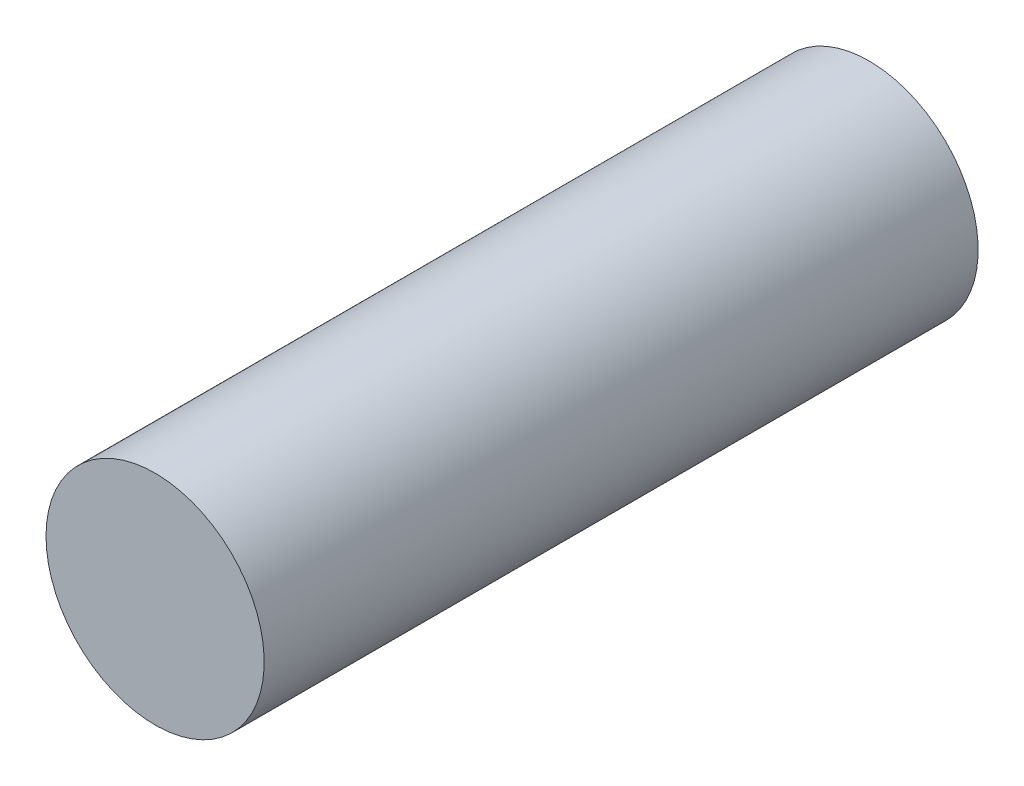
ISO-10303-21;
HEADER;
FILE_DESCRIPTION(('STEP AP214'),'2;1');
FILE_NAME('part.step','',(''),(''),'','','');
FILE_SCHEMA(('AUTOMOTIVE_DESIGN { 1 0 10303 214 1 1 1 1 }'));
ENDSEC;
DATA;
#1=APPLICATION_CONTEXT('core data for automotive mechanical design processes');
#2=APPLICATION_PROTOCOL_DEFINITION('international standard','automotive_design',2000,#1);
#3=PRODUCT_CONTEXT('',#1,'mechanical');
#4=PRODUCT('Part','Part','',(#3));
#5=PRODUCT_RELATED_PRODUCT_CATEGORY('part','',(#4));
#6=PRODUCT_DEFINITION_FORMATION('','',#4);
#7=PRODUCT_DEFINITION_CONTEXT('part definition',#1,'design');
#8=PRODUCT_DEFINITION('design','',#6,#7);
#9=PRODUCT_DEFINITION_SHAPE('','',#8);
#10=(LENGTH_UNIT() NAMED_UNIT(*) SI_UNIT(.MILLI.,.METRE.));
#11=(NAMED_UNIT(*) PLANE_ANGLE_UNIT() SI_UNIT($,.RADIAN.));
#12=(NAMED_UNIT(*) SI_UNIT($,.STERADIAN.) SOLID_ANGLE_UNIT());
#13=UNCERTAINTY_MEASURE_WITH_UNIT(LENGTH_MEASURE(1.E-05),#10,'distance_accuracy_value','');
#14=(GEOMETRIC_REPRESENTATION_CONTEXT(3) GLOBAL_UNCERTAINTY_ASSIGNED_CONTEXT((#13)) GLOBAL_UNIT_ASSIGNED_CONTEXT((#10,
#11,#12)) REPRESENTATION_CONTEXT('',''));
#15=CARTESIAN_POINT('',(0.,0.,0.));
#16=DIRECTION('',(0.,0.,1.));
#17=DIRECTION('',(1.,0.,0.));
#18=AXIS2_PLACEMENT_3D('',#15,#16,#17);
#19=CARTESIAN_POINT('',(0.,0.,180.));
#20=DIRECTION('',(0.,0.,-1.));
#21=DIRECTION('',(-1.,0.,0.));
#22=AXIS2_PLACEMENT_3D('',#19,#20,#21);
#23=CYLINDRICAL_SURFACE('',#22,27.5);
#24=CARTESIAN_POINT('',(0.,0.,180.));
#25=DIRECTION('',(0.,0.,1.));
#26=DIRECTION('',(1.,0.,0.));
#27=AXIS2_PLACEMENT_3D('',#24,#25,#26);
#28=CIRCLE('',#27,27.5);
#29=CARTESIAN_POINT('',(-27.5,0.,180.));
#30=VERTEX_POINT('',#29);
#31=EDGE_CURVE('E10',#30,#30,#28,.T.);
#32=CARTESIAN_POINT('',(0.,0.,0.));
#33=DIRECTION('',(0.,0.,1.));
#34=DIRECTION('',(1.,0.,0.));
#35=AXIS2_PLACEMENT_3D('',#32,#33,#34);
#36=CIRCLE('',#35,27.5);
#37=CARTESIAN_POINT('',(-27.5,0.,0.));
#38=VERTEX_POINT('',#37);
#39=EDGE_CURVE('E37',#38,#38,#36,.T.);
#40=CARTESIAN_POINT('',(-27.5,0.,180.));
#41=CARTESIAN_POINT('',(-27.5,0.,178.125));
#42=CARTESIAN_POINT('',(-27.5,0.,176.25));
#43=CARTESIAN_POINT('',(-27.5,0.,172.5));
#44=CARTESIAN_POINT('',(-27.5,0.,170.625));
#45=CARTESIAN_POINT('',(-27.5,0.,166.875));
#46=CARTESIAN_POINT('',(-27.5,0.,165.));
#47=CARTESIAN_POINT('',(-27.5,0.,161.25));
#48=CARTESIAN_POINT('',(-27.5,0.,159.375));
#49=CARTESIAN_POINT('',(-27.5,0.,155.625));
#50=CARTESIAN_POINT('',(-27.5,0.,153.75));
#51=CARTESIAN_POINT('',(-27.5,0.,150.));
#52=CARTESIAN_POINT('',(-27.5,0.,148.125));
#53=CARTESIAN_POINT('',(-27.5,0.,144.375));
#54=CARTESIAN_POINT('',(-27.5,0.,142.5));
#55=CARTESIAN_POINT('',(-27.5,0.,138.75));
#56=CARTESIAN_POINT('',(-27.5,0.,136.875));
#57=CARTESIAN_POINT('',(-27.5,0.,133.125));
#58=CARTESIAN_POINT('',(-27.5,0.,131.25));
#59=CARTESIAN_POINT('',(-27.5,0.,127.5));
#60=CARTESIAN_POINT('',(-27.5,0.,125.625));
#61=CARTESIAN_POINT('',(-27.5,0.,121.875));
#62=CARTESIAN_POINT('',(-27.5,0.,120.));
#63=CARTESIAN_POINT('',(-27.5,0.,116.25));
#64=CARTESIAN_POINT('',(-27.5,0.,114.375));
#65=CARTESIAN_POINT('',(-27.5,0.,110.625));
#66=CARTESIAN_POINT('',(-27.5,0.,108.75));
#67=CARTESIAN_POINT('',(-27.5,0.,105.));
#68=CARTESIAN_POINT('',(-27.5,0.,103.125));
#69=CARTESIAN_POINT('',(-27.5,0.,99.375));
#70=CARTESIAN_POINT('',(-27.5,0.,97.5));
#71=CARTESIAN_POINT('',(-27.5,0.,93.75));
#72=CARTESIAN_POINT('',(-27.5,0.,91.875));
#73=CARTESIAN_POINT('',(-27.5,0.,88.125));
#74=CARTESIAN_POINT('',(-27.5,0.,86.25));
#75=CARTESIAN_POINT('',(-27.5,0.,82.5));
#76=CARTESIAN_POINT('',(-27.5,0.,80.625));
#77=CARTESIAN_POINT('',(-27.5,0.,76.875));
#78=CARTESIAN_POINT('',(-27.5,0.,75.));
#79=CARTESIAN_POINT('',(-27.5,0.,71.25));
#80=CARTESIAN_POINT('',(-27.5,0.,69.375));
#81=CARTESIAN_POINT('',(-27.5,0.,65.625));
#82=CARTESIAN_POINT('',(-27.5,0.,63.75));
#83=CARTESIAN_POINT('',(-27.5,0.,60.));
#84=CARTESIAN_POINT('',(-27.5,0.,58.125));
#85=CARTESIAN_POINT('',(-27.5,0.,54.375));
#86=CARTESIAN_POINT('',(-27.5,0.,52.5));
#87=CARTESIAN_POINT('',(-27.5,0.,48.75));
#88=CARTESIAN_POINT('',(-27.5,0.,46.875));
#89=CARTESIAN_POINT('',(-27.5,0.,43.125));
#90=CARTESIAN_POINT('',(-27.5,0.,41.25));
#91=CARTESIAN_POINT('',(-27.5,0.,37.5));
#92=CARTESIAN_POINT('',(-27.5,0.,35.625));
#93=CARTESIAN_POINT('',(-27.5,0.,31.875));
#94=CARTESIAN_POINT('',(-27.5,0.,30.));
#95=CARTESIAN_POINT('',(-27.5,0.,26.25));
#96=CARTESIAN_POINT('',(-27.5,0.,24.375));
#97=CARTESIAN_POINT('',(-27.5,0.,20.625));
#98=CARTESIAN_POINT('',(-27.5,0.,18.75));
#99=CARTESIAN_POINT('',(-27.5,0.,15.));
#100=CARTESIAN_POINT('',(-27.5,0.,13.125));
#101=CARTESIAN_POINT('',(-27.5,0.,9.37499999999998));
#102=CARTESIAN_POINT('',(-27.5,0.,7.49999999999997));
#103=CARTESIAN_POINT('',(-27.5,0.,3.74999999999997));
#104=CARTESIAN_POINT('',(-27.5,0.,1.87499999999997));
#105=CARTESIAN_POINT('',(-27.5,0.,0.));
#106=B_SPLINE_CURVE_WITH_KNOTS('',3,(#40,#41,#42,#43,#44,#45,#46,#47,#48,#49,#50,#51,#52,#53,
#54,#55,#56,#57,#58,#59,#60,#61,#62,#63,#64,#65,#66,#67,#68,#69,#70,#71,#72,#73,#74,#75,#76,#77,
#78,#79,#80,#81,#82,#83,#84,#85,#86,#87,#88,#89,#90,#91,#92,#93,#94,#95,#96,#97,#98,#99,#100,
#101,#102,#103,#104,#105),.UNSPECIFIED.,.F.,.F.,(4,2,2,2,2,2,2,2,2,2,2,2,2,2,2,2,2,2,2,2,2,2,2,
2,2,2,2,2,2,2,2,2,4),(0.,5.62500000000002,11.25,16.875,22.5,28.125,33.75,39.375,45.,50.625,
56.25,61.875,67.5,73.125,78.75,84.375,90.,95.625,101.25,106.875,112.5,118.125,123.75,129.375,
135.,140.625,146.25,151.875,157.5,163.125,168.75,174.375,180.),.UNSPECIFIED.);
#107=EDGE_CURVE('BSEAM40',#30,#38,#106,.T.);
#108=ORIENTED_EDGE('',*,*,#31,.F.);
#109=ORIENTED_EDGE('',*,*,#39,.T.);
#110=ORIENTED_EDGE('',*,*,#107,.T.);
#111=ORIENTED_EDGE('',*,*,#107,.F.);
#112=EDGE_LOOP('',(#108,#110,#109,#111));
#113=FACE_BOUND('',#112,.T.);
#114=ADVANCED_FACE('F40',(#113),#23,.T.);
#115=CARTESIAN_POINT('',(0.,0.,180.));
#116=DIRECTION('',(0.,0.,1.));
#117=DIRECTION('',(1.,0.,0.));
#118=AXIS2_PLACEMENT_3D('',#115,#116,#117);
#119=PLANE('',#118);
#120=ORIENTED_EDGE('',*,*,#31,.T.);
#121=EDGE_LOOP('',(#120));
#122=FACE_BOUND('',#121,.T.);
#123=ADVANCED_FACE('F55',(#122),#119,.T.);
#124=CARTESIAN_POINT('',(0.,0.,0.));
#125=DIRECTION('',(0.,0.,1.));
#126=DIRECTION('',(1.,0.,0.));
#127=AXIS2_PLACEMENT_3D('',#124,#125,#126);
#128=PLANE('',#127);
#129=ORIENTED_EDGE('',*,*,#39,.F.);
#130=EDGE_LOOP('',(#129));
#131=FACE_BOUND('',#130,.T.);
#132=ADVANCED_FACE('F49',(#131),#128,.F.);
#133=CLOSED_SHELL('',(#114,#123,#132));
#134=MANIFOLD_SOLID_BREP('B2',#133);
#135=ADVANCED_BREP_SHAPE_REPRESENTATION('',(#18,#134),#14);
#136=SHAPE_DEFINITION_REPRESENTATION(#9,#135);
ENDSEC;
END-ISO-10303-21;
